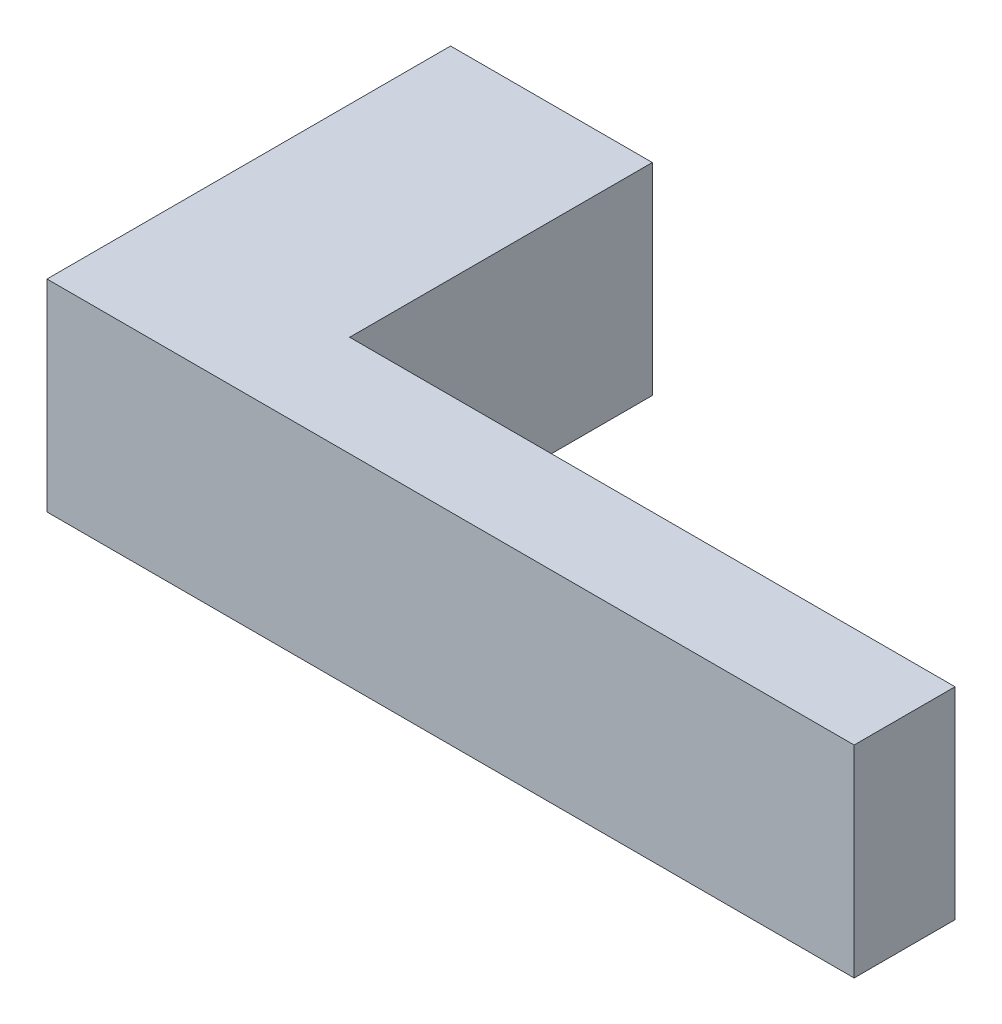
ISO-10303-21;
HEADER;
FILE_DESCRIPTION(('STEP AP214'),'2;1');
FILE_NAME('part.step','',(''),(''),'','','');
FILE_SCHEMA(('AUTOMOTIVE_DESIGN { 1 0 10303 214 1 1 1 1 }'));
ENDSEC;
DATA;
#1=APPLICATION_CONTEXT('core data for automotive mechanical design processes');
#2=APPLICATION_PROTOCOL_DEFINITION('international standard','automotive_design',2000,#1);
#3=PRODUCT_CONTEXT('',#1,'mechanical');
#4=PRODUCT('Part','Part','',(#3));
#5=PRODUCT_RELATED_PRODUCT_CATEGORY('part','',(#4));
#6=PRODUCT_DEFINITION_FORMATION('','',#4);
#7=PRODUCT_DEFINITION_CONTEXT('part definition',#1,'design');
#8=PRODUCT_DEFINITION('design','',#6,#7);
#9=PRODUCT_DEFINITION_SHAPE('','',#8);
#10=(LENGTH_UNIT() NAMED_UNIT(*) SI_UNIT(.MILLI.,.METRE.));
#11=(NAMED_UNIT(*) PLANE_ANGLE_UNIT() SI_UNIT($,.RADIAN.));
#12=(NAMED_UNIT(*) SI_UNIT($,.STERADIAN.) SOLID_ANGLE_UNIT());
#13=UNCERTAINTY_MEASURE_WITH_UNIT(LENGTH_MEASURE(1.E-05),#10,'distance_accuracy_value','');
#14=(GEOMETRIC_REPRESENTATION_CONTEXT(3) GLOBAL_UNCERTAINTY_ASSIGNED_CONTEXT((#13)) GLOBAL_UNIT_ASSIGNED_CONTEXT((#10,
#11,#12)) REPRESENTATION_CONTEXT('',''));
#15=CARTESIAN_POINT('',(0.,0.,0.));
#16=DIRECTION('',(0.,0.,1.));
#17=DIRECTION('',(1.,0.,0.));
#18=AXIS2_PLACEMENT_3D('',#15,#16,#17);
#19=CARTESIAN_POINT('',(80.,20.,40.));
#20=DIRECTION('',(-1.,0.,0.));
#21=DIRECTION('',(0.,0.,1.));
#22=AXIS2_PLACEMENT_3D('',#19,#20,#21);
#23=PLANE('',#22);
#24=DIRECTION('',(0.,0.,-1.));
#25=VECTOR('',#24,1.);
#26=CARTESIAN_POINT('',(80.,0.,40.));
#27=LINE('',#26,#25);
#28=CARTESIAN_POINT('',(80.,0.,40.));
#29=VERTEX_POINT('',#28);
#30=CARTESIAN_POINT('',(80.,0.,30.));
#31=VERTEX_POINT('',#30);
#32=EDGE_CURVE('E128',#29,#31,#27,.T.);
#33=ORIENTED_EDGE('',*,*,#32,.T.);
#34=DIRECTION('',(0.,-1.,0.));
#35=VECTOR('',#34,1.);
#36=CARTESIAN_POINT('',(80.,20.,30.));
#37=LINE('',#36,#35);
#38=CARTESIAN_POINT('',(80.,20.,30.));
#39=VERTEX_POINT('',#38);
#40=EDGE_CURVE('E11',#39,#31,#37,.T.);
#41=ORIENTED_EDGE('',*,*,#40,.F.);
#42=DIRECTION('',(0.,0.,-1.));
#43=VECTOR('',#42,1.);
#44=CARTESIAN_POINT('',(80.,20.,40.));
#45=LINE('',#44,#43);
#46=CARTESIAN_POINT('',(80.,20.,40.));
#47=VERTEX_POINT('',#46);
#48=EDGE_CURVE('E144',#47,#39,#45,.T.);
#49=ORIENTED_EDGE('',*,*,#48,.F.);
#50=DIRECTION('',(0.,-1.,0.));
#51=VECTOR('',#50,1.);
#52=CARTESIAN_POINT('',(80.,20.,40.));
#53=LINE('',#52,#51);
#54=EDGE_CURVE('E124',#47,#29,#53,.T.);
#55=ORIENTED_EDGE('',*,*,#54,.T.);
#56=EDGE_LOOP('',(#33,#41,#49,#55));
#57=FACE_BOUND('',#56,.T.);
#58=ADVANCED_FACE('F39',(#57),#23,.F.);
#59=CARTESIAN_POINT('',(80.,20.,30.));
#60=DIRECTION('',(0.,0.,1.));
#61=DIRECTION('',(1.,0.,0.));
#62=AXIS2_PLACEMENT_3D('',#59,#60,#61);
#63=PLANE('',#62);
#64=DIRECTION('',(-1.,0.,0.));
#65=VECTOR('',#64,1.);
#66=CARTESIAN_POINT('',(80.,0.,30.));
#67=LINE('',#66,#65);
#68=CARTESIAN_POINT('',(20.,0.,30.));
#69=VERTEX_POINT('',#68);
#70=EDGE_CURVE('E132',#31,#69,#67,.T.);
#71=ORIENTED_EDGE('',*,*,#70,.T.);
#72=DIRECTION('',(0.,-1.,0.));
#73=VECTOR('',#72,1.);
#74=CARTESIAN_POINT('',(20.,20.,30.));
#75=LINE('',#74,#73);
#76=CARTESIAN_POINT('',(20.,20.,30.));
#77=VERTEX_POINT('',#76);
#78=EDGE_CURVE('E48',#77,#69,#75,.T.);
#79=ORIENTED_EDGE('',*,*,#78,.F.);
#80=DIRECTION('',(-1.,0.,0.));
#81=VECTOR('',#80,1.);
#82=CARTESIAN_POINT('',(80.,20.,30.));
#83=LINE('',#82,#81);
#84=EDGE_CURVE('E93',#39,#77,#83,.T.);
#85=ORIENTED_EDGE('',*,*,#84,.F.);
#86=ORIENTED_EDGE('',*,*,#40,.T.);
#87=EDGE_LOOP('',(#71,#79,#85,#86));
#88=FACE_BOUND('',#87,.T.);
#89=ADVANCED_FACE('F172',(#88),#63,.F.);
#90=CARTESIAN_POINT('',(20.,20.,30.));
#91=DIRECTION('',(-1.,0.,0.));
#92=DIRECTION('',(0.,0.,1.));
#93=AXIS2_PLACEMENT_3D('',#90,#91,#92);
#94=PLANE('',#93);
#95=DIRECTION('',(0.,0.,-1.));
#96=VECTOR('',#95,1.);
#97=CARTESIAN_POINT('',(20.,0.,30.));
#98=LINE('',#97,#96);
#99=CARTESIAN_POINT('',(20.,0.,0.));
#100=VERTEX_POINT('',#99);
#101=EDGE_CURVE('E135',#69,#100,#98,.T.);
#102=ORIENTED_EDGE('',*,*,#101,.T.);
#103=DIRECTION('',(0.,-1.,0.));
#104=VECTOR('',#103,1.);
#105=CARTESIAN_POINT('',(20.,20.,0.));
#106=LINE('',#105,#104);
#107=CARTESIAN_POINT('',(20.,20.,0.));
#108=VERTEX_POINT('',#107);
#109=EDGE_CURVE('E117',#108,#100,#106,.T.);
#110=ORIENTED_EDGE('',*,*,#109,.F.);
#111=DIRECTION('',(0.,0.,-1.));
#112=VECTOR('',#111,1.);
#113=CARTESIAN_POINT('',(20.,20.,30.));
#114=LINE('',#113,#112);
#115=EDGE_CURVE('E106',#77,#108,#114,.T.);
#116=ORIENTED_EDGE('',*,*,#115,.F.);
#117=ORIENTED_EDGE('',*,*,#78,.T.);
#118=EDGE_LOOP('',(#102,#110,#116,#117));
#119=FACE_BOUND('',#118,.T.);
#120=ADVANCED_FACE('F154',(#119),#94,.F.);
#121=CARTESIAN_POINT('',(0.,20.,0.));
#122=DIRECTION('',(0.,0.,1.));
#123=DIRECTION('',(1.,0.,0.));
#124=AXIS2_PLACEMENT_3D('',#121,#122,#123);
#125=PLANE('',#124);
#126=DIRECTION('',(-1.,0.,0.));
#127=VECTOR('',#126,1.);
#128=CARTESIAN_POINT('',(0.,0.,0.));
#129=LINE('',#128,#127);
#130=CARTESIAN_POINT('',(0.,0.,0.));
#131=VERTEX_POINT('',#130);
#132=EDGE_CURVE('E115',#100,#131,#129,.T.);
#133=ORIENTED_EDGE('',*,*,#132,.T.);
#134=DIRECTION('',(0.,-1.,0.));
#135=VECTOR('',#134,1.);
#136=CARTESIAN_POINT('',(0.,20.,0.));
#137=LINE('',#136,#135);
#138=CARTESIAN_POINT('',(0.,20.,0.));
#139=VERTEX_POINT('',#138);
#140=EDGE_CURVE('E112',#139,#131,#137,.T.);
#141=ORIENTED_EDGE('',*,*,#140,.F.);
#142=DIRECTION('',(-1.,0.,0.));
#143=VECTOR('',#142,1.);
#144=CARTESIAN_POINT('',(0.,20.,0.));
#145=LINE('',#144,#143);
#146=EDGE_CURVE('E100',#108,#139,#145,.T.);
#147=ORIENTED_EDGE('',*,*,#146,.F.);
#148=ORIENTED_EDGE('',*,*,#109,.T.);
#149=EDGE_LOOP('',(#133,#141,#147,#148));
#150=FACE_BOUND('',#149,.T.);
#151=ADVANCED_FACE('F113',(#150),#125,.F.);
#152=CARTESIAN_POINT('',(0.,20.,40.));
#153=DIRECTION('',(1.,0.,0.));
#154=DIRECTION('',(0.,0.,-1.));
#155=AXIS2_PLACEMENT_3D('',#152,#153,#154);
#156=PLANE('',#155);
#157=DIRECTION('',(0.,0.,1.));
#158=VECTOR('',#157,1.);
#159=CARTESIAN_POINT('',(0.,0.,40.));
#160=LINE('',#159,#158);
#161=CARTESIAN_POINT('',(0.,0.,40.));
#162=VERTEX_POINT('',#161);
#163=EDGE_CURVE('E79',#131,#162,#160,.T.);
#164=ORIENTED_EDGE('',*,*,#163,.T.);
#165=DIRECTION('',(0.,-1.,0.));
#166=VECTOR('',#165,1.);
#167=CARTESIAN_POINT('',(0.,20.,40.));
#168=LINE('',#167,#166);
#169=CARTESIAN_POINT('',(0.,20.,40.));
#170=VERTEX_POINT('',#169);
#171=EDGE_CURVE('E118',#170,#162,#168,.T.);
#172=ORIENTED_EDGE('',*,*,#171,.F.);
#173=DIRECTION('',(0.,0.,1.));
#174=VECTOR('',#173,1.);
#175=CARTESIAN_POINT('',(0.,20.,40.));
#176=LINE('',#175,#174);
#177=EDGE_CURVE('E104',#139,#170,#176,.T.);
#178=ORIENTED_EDGE('',*,*,#177,.F.);
#179=ORIENTED_EDGE('',*,*,#140,.T.);
#180=EDGE_LOOP('',(#164,#172,#178,#179));
#181=FACE_BOUND('',#180,.T.);
#182=ADVANCED_FACE('F120',(#181),#156,.F.);
#183=CARTESIAN_POINT('',(80.,20.,40.));
#184=DIRECTION('',(0.,0.,-1.));
#185=DIRECTION('',(-1.,0.,0.));
#186=AXIS2_PLACEMENT_3D('',#183,#184,#185);
#187=PLANE('',#186);
#188=DIRECTION('',(1.,0.,0.));
#189=VECTOR('',#188,1.);
#190=CARTESIAN_POINT('',(80.,0.,40.));
#191=LINE('',#190,#189);
#192=EDGE_CURVE('E85',#162,#29,#191,.T.);
#193=ORIENTED_EDGE('',*,*,#192,.T.);
#194=ORIENTED_EDGE('',*,*,#54,.F.);
#195=DIRECTION('',(1.,0.,0.));
#196=VECTOR('',#195,1.);
#197=CARTESIAN_POINT('',(80.,20.,40.));
#198=LINE('',#197,#196);
#199=EDGE_CURVE('E56',#170,#47,#198,.T.);
#200=ORIENTED_EDGE('',*,*,#199,.F.);
#201=ORIENTED_EDGE('',*,*,#171,.T.);
#202=EDGE_LOOP('',(#193,#194,#200,#201));
#203=FACE_BOUND('',#202,.T.);
#204=ADVANCED_FACE('F161',(#203),#187,.F.);
#205=CARTESIAN_POINT('',(0.,20.,0.));
#206=DIRECTION('',(0.,1.,0.));
#207=DIRECTION('',(0.,0.,1.));
#208=AXIS2_PLACEMENT_3D('',#205,#206,#207);
#209=PLANE('',#208);
#210=ORIENTED_EDGE('',*,*,#48,.T.);
#211=ORIENTED_EDGE('',*,*,#84,.T.);
#212=ORIENTED_EDGE('',*,*,#115,.T.);
#213=ORIENTED_EDGE('',*,*,#146,.T.);
#214=ORIENTED_EDGE('',*,*,#177,.T.);
#215=ORIENTED_EDGE('',*,*,#199,.T.);
#216=EDGE_LOOP('',(#210,#211,#212,#213,#214,#215));
#217=FACE_BOUND('',#216,.T.);
#218=ADVANCED_FACE('F102',(#217),#209,.T.);
#219=CARTESIAN_POINT('',(0.,0.,0.));
#220=DIRECTION('',(0.,1.,0.));
#221=DIRECTION('',(0.,0.,1.));
#222=AXIS2_PLACEMENT_3D('',#219,#220,#221);
#223=PLANE('',#222);
#224=ORIENTED_EDGE('',*,*,#32,.F.);
#225=ORIENTED_EDGE('',*,*,#192,.F.);
#226=ORIENTED_EDGE('',*,*,#163,.F.);
#227=ORIENTED_EDGE('',*,*,#132,.F.);
#228=ORIENTED_EDGE('',*,*,#101,.F.);
#229=ORIENTED_EDGE('',*,*,#70,.F.);
#230=EDGE_LOOP('',(#224,#225,#226,#227,#228,#229));
#231=FACE_BOUND('',#230,.T.);
#232=ADVANCED_FACE('F157',(#231),#223,.F.);
#233=CLOSED_SHELL('',(#58,#89,#120,#151,#182,#204,#218,#232));
#234=MANIFOLD_SOLID_BREP('B2',#233);
#235=ADVANCED_BREP_SHAPE_REPRESENTATION('',(#18,#234),#14);
#236=SHAPE_DEFINITION_REPRESENTATION(#9,#235);
ENDSEC;
END-ISO-10303-21;
